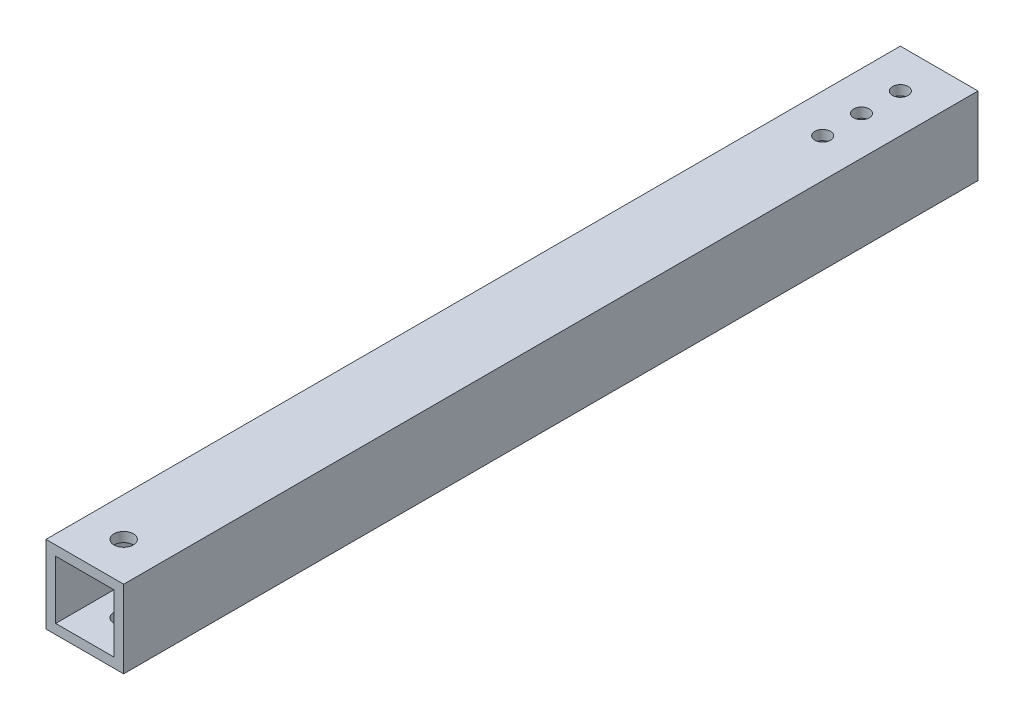
ISO-10303-21;
HEADER;
FILE_DESCRIPTION(('STEP AP214'),'2;1');
FILE_NAME('part.step','',(''),(''),'','','');
FILE_SCHEMA(('AUTOMOTIVE_DESIGN { 1 0 10303 214 1 1 1 1 }'));
ENDSEC;
DATA;
#1=APPLICATION_CONTEXT('core data for automotive mechanical design processes');
#2=APPLICATION_PROTOCOL_DEFINITION('international standard','automotive_design',2000,#1);
#3=PRODUCT_CONTEXT('',#1,'mechanical');
#4=PRODUCT('Part','Part','',(#3));
#5=PRODUCT_RELATED_PRODUCT_CATEGORY('part','',(#4));
#6=PRODUCT_DEFINITION_FORMATION('','',#4);
#7=PRODUCT_DEFINITION_CONTEXT('part definition',#1,'design');
#8=PRODUCT_DEFINITION('design','',#6,#7);
#9=PRODUCT_DEFINITION_SHAPE('','',#8);
#10=(LENGTH_UNIT() NAMED_UNIT(*) SI_UNIT(.MILLI.,.METRE.));
#11=(NAMED_UNIT(*) PLANE_ANGLE_UNIT() SI_UNIT($,.RADIAN.));
#12=(NAMED_UNIT(*) SI_UNIT($,.STERADIAN.) SOLID_ANGLE_UNIT());
#13=UNCERTAINTY_MEASURE_WITH_UNIT(LENGTH_MEASURE(1.E-05),#10,'distance_accuracy_value','');
#14=(GEOMETRIC_REPRESENTATION_CONTEXT(3) GLOBAL_UNCERTAINTY_ASSIGNED_CONTEXT((#13)) GLOBAL_UNIT_ASSIGNED_CONTEXT((#10,
#11,#12)) REPRESENTATION_CONTEXT('',''));
#15=CARTESIAN_POINT('',(0.,0.,0.));
#16=DIRECTION('',(0.,0.,1.));
#17=DIRECTION('',(1.,0.,0.));
#18=AXIS2_PLACEMENT_3D('',#15,#16,#17);
#19=CARTESIAN_POINT('',(0.,0.,279.4));
#20=DIRECTION('',(0.,1.,0.));
#21=DIRECTION('',(0.,0.,1.));
#22=AXIS2_PLACEMENT_3D('',#19,#20,#21);
#23=PLANE('',#22);
#24=CARTESIAN_POINT('',(-12.7,0.,266.7));
#25=DIRECTION('',(0.,1.,0.));
#26=DIRECTION('',(0.,0.,1.));
#27=AXIS2_PLACEMENT_3D('',#24,#25,#26);
#28=CIRCLE('',#27,3.175);
#29=CARTESIAN_POINT('',(-12.7,0.,263.525));
#30=VERTEX_POINT('',#29);
#31=EDGE_CURVE('E134',#30,#30,#28,.T.);
#32=ORIENTED_EDGE('',*,*,#31,.T.);
#33=EDGE_LOOP('',(#32));
#34=FACE_BOUND('',#33,.T.);
#35=DIRECTION('',(1.,0.,0.));
#36=VECTOR('',#35,1.);
#37=CARTESIAN_POINT('',(0.,0.,0.));
#38=LINE('',#37,#36);
#39=CARTESIAN_POINT('',(-25.4,0.,0.));
#40=VERTEX_POINT('',#39);
#41=CARTESIAN_POINT('',(0.,0.,0.));
#42=VERTEX_POINT('',#41);
#43=EDGE_CURVE('E148',#40,#42,#38,.T.);
#44=ORIENTED_EDGE('',*,*,#43,.T.);
#45=DIRECTION('',(0.,0.,-1.));
#46=VECTOR('',#45,1.);
#47=CARTESIAN_POINT('',(0.,0.,279.4));
#48=LINE('',#47,#46);
#49=CARTESIAN_POINT('',(0.,0.,279.4));
#50=VERTEX_POINT('',#49);
#51=EDGE_CURVE('E154',#50,#42,#48,.T.);
#52=ORIENTED_EDGE('',*,*,#51,.F.);
#53=DIRECTION('',(1.,0.,0.));
#54=VECTOR('',#53,1.);
#55=CARTESIAN_POINT('',(0.,0.,279.4));
#56=LINE('',#55,#54);
#57=CARTESIAN_POINT('',(-25.4,0.,279.4));
#58=VERTEX_POINT('',#57);
#59=EDGE_CURVE('E152',#58,#50,#56,.T.);
#60=ORIENTED_EDGE('',*,*,#59,.F.);
#61=DIRECTION('',(0.,0.,-1.));
#62=VECTOR('',#61,1.);
#63=CARTESIAN_POINT('',(-25.4,0.,279.4));
#64=LINE('',#63,#62);
#65=EDGE_CURVE('E164',#58,#40,#64,.T.);
#66=ORIENTED_EDGE('',*,*,#65,.T.);
#67=EDGE_LOOP('',(#44,#52,#60,#66));
#68=FACE_BOUND('',#67,.T.);
#69=CARTESIAN_POINT('',(-12.7,0.,12.7));
#70=DIRECTION('',(0.,1.,0.));
#71=DIRECTION('',(0.,0.,1.));
#72=AXIS2_PLACEMENT_3D('',#69,#70,#71);
#73=CIRCLE('',#72,2.55269999999999);
#74=CARTESIAN_POINT('',(-12.7,0.,15.2527));
#75=VERTEX_POINT('',#74);
#76=EDGE_CURVE('E177',#75,#75,#73,.F.);
#77=ORIENTED_EDGE('',*,*,#76,.F.);
#78=EDGE_LOOP('',(#77));
#79=FACE_BOUND('',#78,.T.);
#80=CARTESIAN_POINT('',(-12.7,0.,25.4));
#81=DIRECTION('',(0.,1.,0.));
#82=DIRECTION('',(0.,0.,1.));
#83=AXIS2_PLACEMENT_3D('',#80,#81,#82);
#84=CIRCLE('',#83,2.55269999999999);
#85=CARTESIAN_POINT('',(-12.7,0.,27.9527));
#86=VERTEX_POINT('',#85);
#87=EDGE_CURVE('E181',#86,#86,#84,.F.);
#88=ORIENTED_EDGE('',*,*,#87,.F.);
#89=EDGE_LOOP('',(#88));
#90=FACE_BOUND('',#89,.T.);
#91=CARTESIAN_POINT('',(-12.7,0.,38.1));
#92=DIRECTION('',(0.,1.,0.));
#93=DIRECTION('',(0.,0.,1.));
#94=AXIS2_PLACEMENT_3D('',#91,#92,#93);
#95=CIRCLE('',#94,2.55269999999999);
#96=CARTESIAN_POINT('',(-12.7,0.,40.6527));
#97=VERTEX_POINT('',#96);
#98=EDGE_CURVE('E276',#97,#97,#95,.F.);
#99=ORIENTED_EDGE('',*,*,#98,.F.);
#100=EDGE_LOOP('',(#99));
#101=FACE_BOUND('',#100,.T.);
#102=ADVANCED_FACE('F38',(#34,#68,#79,#90,#101),#23,.F.);
#103=CARTESIAN_POINT('',(0.,0.,279.4));
#104=DIRECTION('',(0.,0.,1.));
#105=DIRECTION('',(1.,0.,0.));
#106=AXIS2_PLACEMENT_3D('',#103,#104,#105);
#107=PLANE('',#106);
#108=DIRECTION('',(0.,1.,0.));
#109=VECTOR('',#108,1.);
#110=CARTESIAN_POINT('',(0.,0.,279.4));
#111=LINE('',#110,#109);
#112=CARTESIAN_POINT('',(0.,25.4,279.4));
#113=VERTEX_POINT('',#112);
#114=EDGE_CURVE('E144',#50,#113,#111,.T.);
#115=ORIENTED_EDGE('',*,*,#114,.T.);
#116=DIRECTION('',(-1.,0.,0.));
#117=VECTOR('',#116,1.);
#118=CARTESIAN_POINT('',(0.,25.4,279.4));
#119=LINE('',#118,#117);
#120=CARTESIAN_POINT('',(-25.4,25.4,279.4));
#121=VERTEX_POINT('',#120);
#122=EDGE_CURVE('E147',#113,#121,#119,.T.);
#123=ORIENTED_EDGE('',*,*,#122,.T.);
#124=DIRECTION('',(0.,-1.,0.));
#125=VECTOR('',#124,1.);
#126=CARTESIAN_POINT('',(-25.4,0.,279.4));
#127=LINE('',#126,#125);
#128=EDGE_CURVE('E150',#121,#58,#127,.T.);
#129=ORIENTED_EDGE('',*,*,#128,.T.);
#130=ORIENTED_EDGE('',*,*,#59,.T.);
#131=EDGE_LOOP('',(#115,#123,#129,#130));
#132=FACE_BOUND('',#131,.T.);
#133=DIRECTION('',(-1.,0.,0.));
#134=VECTOR('',#133,1.);
#135=CARTESIAN_POINT('',(-3.175,22.225,279.4));
#136=LINE('',#135,#134);
#137=CARTESIAN_POINT('',(-3.175,22.225,279.4));
#138=VERTEX_POINT('',#137);
#139=CARTESIAN_POINT('',(-22.225,22.225,279.4));
#140=VERTEX_POINT('',#139);
#141=EDGE_CURVE('E113',#138,#140,#136,.T.);
#142=ORIENTED_EDGE('',*,*,#141,.F.);
#143=DIRECTION('',(0.,1.,0.));
#144=VECTOR('',#143,1.);
#145=CARTESIAN_POINT('',(-3.175,3.175,279.4));
#146=LINE('',#145,#144);
#147=CARTESIAN_POINT('',(-3.175,3.175,279.4));
#148=VERTEX_POINT('',#147);
#149=EDGE_CURVE('E105',#148,#138,#146,.T.);
#150=ORIENTED_EDGE('',*,*,#149,.F.);
#151=DIRECTION('',(1.,0.,0.));
#152=VECTOR('',#151,1.);
#153=CARTESIAN_POINT('',(-3.175,3.175,279.4));
#154=LINE('',#153,#152);
#155=CARTESIAN_POINT('',(-22.225,3.175,279.4));
#156=VERTEX_POINT('',#155);
#157=EDGE_CURVE('E128',#156,#148,#154,.T.);
#158=ORIENTED_EDGE('',*,*,#157,.F.);
#159=DIRECTION('',(0.,-1.,0.));
#160=VECTOR('',#159,1.);
#161=CARTESIAN_POINT('',(-22.225,3.175,279.4));
#162=LINE('',#161,#160);
#163=EDGE_CURVE('E126',#140,#156,#162,.T.);
#164=ORIENTED_EDGE('',*,*,#163,.F.);
#165=EDGE_LOOP('',(#142,#150,#158,#164));
#166=FACE_BOUND('',#165,.T.);
#167=ADVANCED_FACE('F125',(#132,#166),#107,.T.);
#168=CARTESIAN_POINT('',(0.,0.,0.));
#169=DIRECTION('',(0.,0.,1.));
#170=DIRECTION('',(1.,0.,0.));
#171=AXIS2_PLACEMENT_3D('',#168,#169,#170);
#172=PLANE('',#171);
#173=DIRECTION('',(0.,1.,0.));
#174=VECTOR('',#173,1.);
#175=CARTESIAN_POINT('',(0.,0.,0.));
#176=LINE('',#175,#174);
#177=CARTESIAN_POINT('',(0.,25.4,0.));
#178=VERTEX_POINT('',#177);
#179=EDGE_CURVE('E121',#42,#178,#176,.T.);
#180=ORIENTED_EDGE('',*,*,#179,.F.);
#181=ORIENTED_EDGE('',*,*,#43,.F.);
#182=DIRECTION('',(0.,-1.,0.));
#183=VECTOR('',#182,1.);
#184=CARTESIAN_POINT('',(-25.4,0.,0.));
#185=LINE('',#184,#183);
#186=CARTESIAN_POINT('',(-25.4,25.4,0.));
#187=VERTEX_POINT('',#186);
#188=EDGE_CURVE('E159',#187,#40,#185,.T.);
#189=ORIENTED_EDGE('',*,*,#188,.F.);
#190=DIRECTION('',(-1.,0.,0.));
#191=VECTOR('',#190,1.);
#192=CARTESIAN_POINT('',(0.,25.4,0.));
#193=LINE('',#192,#191);
#194=EDGE_CURVE('E157',#178,#187,#193,.T.);
#195=ORIENTED_EDGE('',*,*,#194,.F.);
#196=EDGE_LOOP('',(#180,#181,#189,#195));
#197=FACE_BOUND('',#196,.T.);
#198=DIRECTION('',(0.,1.,0.));
#199=VECTOR('',#198,1.);
#200=CARTESIAN_POINT('',(-3.175,3.175,0.));
#201=LINE('',#200,#199);
#202=CARTESIAN_POINT('',(-3.175,3.175,0.));
#203=VERTEX_POINT('',#202);
#204=CARTESIAN_POINT('',(-3.175,22.225,0.));
#205=VERTEX_POINT('',#204);
#206=EDGE_CURVE('E63',#203,#205,#201,.T.);
#207=ORIENTED_EDGE('',*,*,#206,.T.);
#208=DIRECTION('',(-1.,0.,0.));
#209=VECTOR('',#208,1.);
#210=CARTESIAN_POINT('',(-3.175,22.225,0.));
#211=LINE('',#210,#209);
#212=CARTESIAN_POINT('',(-22.225,22.225,0.));
#213=VERTEX_POINT('',#212);
#214=EDGE_CURVE('E120',#205,#213,#211,.T.);
#215=ORIENTED_EDGE('',*,*,#214,.T.);
#216=DIRECTION('',(0.,-1.,0.));
#217=VECTOR('',#216,1.);
#218=CARTESIAN_POINT('',(-22.225,3.175,0.));
#219=LINE('',#218,#217);
#220=CARTESIAN_POINT('',(-22.225,3.175,0.));
#221=VERTEX_POINT('',#220);
#222=EDGE_CURVE('E136',#213,#221,#219,.T.);
#223=ORIENTED_EDGE('',*,*,#222,.T.);
#224=DIRECTION('',(1.,0.,0.));
#225=VECTOR('',#224,1.);
#226=CARTESIAN_POINT('',(-3.175,3.175,0.));
#227=LINE('',#226,#225);
#228=EDGE_CURVE('E114',#221,#203,#227,.T.);
#229=ORIENTED_EDGE('',*,*,#228,.T.);
#230=EDGE_LOOP('',(#207,#215,#223,#229));
#231=FACE_BOUND('',#230,.T.);
#232=ADVANCED_FACE('F233',(#197,#231),#172,.F.);
#233=CARTESIAN_POINT('',(0.,0.,279.4));
#234=DIRECTION('',(-1.,0.,0.));
#235=DIRECTION('',(0.,-1.,0.));
#236=AXIS2_PLACEMENT_3D('',#233,#234,#235);
#237=PLANE('',#236);
#238=ORIENTED_EDGE('',*,*,#179,.T.);
#239=DIRECTION('',(0.,0.,-1.));
#240=VECTOR('',#239,1.);
#241=CARTESIAN_POINT('',(0.,25.4,279.4));
#242=LINE('',#241,#240);
#243=EDGE_CURVE('E11',#113,#178,#242,.T.);
#244=ORIENTED_EDGE('',*,*,#243,.F.);
#245=ORIENTED_EDGE('',*,*,#114,.F.);
#246=ORIENTED_EDGE('',*,*,#51,.T.);
#247=EDGE_LOOP('',(#238,#244,#245,#246));
#248=FACE_BOUND('',#247,.T.);
#249=ADVANCED_FACE('F40',(#248),#237,.F.);
#250=CARTESIAN_POINT('',(0.,25.4,279.4));
#251=DIRECTION('',(0.,-1.,0.));
#252=DIRECTION('',(1.,0.,0.));
#253=AXIS2_PLACEMENT_3D('',#250,#251,#252);
#254=PLANE('',#253);
#255=CARTESIAN_POINT('',(-12.7,25.4,38.1));
#256=DIRECTION('',(0.,1.,0.));
#257=DIRECTION('',(0.,0.,1.));
#258=AXIS2_PLACEMENT_3D('',#255,#256,#257);
#259=CIRCLE('',#258,2.55269999999999);
#260=CARTESIAN_POINT('',(-12.7,25.4,40.6527));
#261=VERTEX_POINT('',#260);
#262=EDGE_CURVE('E251',#261,#261,#259,.T.);
#263=ORIENTED_EDGE('',*,*,#262,.F.);
#264=EDGE_LOOP('',(#263));
#265=FACE_BOUND('',#264,.T.);
#266=CARTESIAN_POINT('',(-12.7,25.4,25.4));
#267=DIRECTION('',(0.,1.,0.));
#268=DIRECTION('',(0.,0.,1.));
#269=AXIS2_PLACEMENT_3D('',#266,#267,#268);
#270=CIRCLE('',#269,2.55269999999999);
#271=CARTESIAN_POINT('',(-12.7,25.4,27.9527));
#272=VERTEX_POINT('',#271);
#273=EDGE_CURVE('E188',#272,#272,#270,.T.);
#274=ORIENTED_EDGE('',*,*,#273,.F.);
#275=EDGE_LOOP('',(#274));
#276=FACE_BOUND('',#275,.T.);
#277=CARTESIAN_POINT('',(-12.7,25.4,12.7));
#278=DIRECTION('',(0.,1.,0.));
#279=DIRECTION('',(0.,0.,1.));
#280=AXIS2_PLACEMENT_3D('',#277,#278,#279);
#281=CIRCLE('',#280,2.55269999999999);
#282=CARTESIAN_POINT('',(-12.7,25.4,15.2527));
#283=VERTEX_POINT('',#282);
#284=EDGE_CURVE('E185',#283,#283,#281,.T.);
#285=ORIENTED_EDGE('',*,*,#284,.F.);
#286=EDGE_LOOP('',(#285));
#287=FACE_BOUND('',#286,.T.);
#288=CARTESIAN_POINT('',(-12.7,25.4,266.7));
#289=DIRECTION('',(0.,-1.,0.));
#290=DIRECTION('',(0.,0.,-1.));
#291=AXIS2_PLACEMENT_3D('',#288,#289,#290);
#292=CIRCLE('',#291,3.175);
#293=CARTESIAN_POINT('',(-12.7,25.4,263.525));
#294=VERTEX_POINT('',#293);
#295=EDGE_CURVE('E173',#294,#294,#292,.T.);
#296=ORIENTED_EDGE('',*,*,#295,.T.);
#297=EDGE_LOOP('',(#296));
#298=FACE_BOUND('',#297,.T.);
#299=ORIENTED_EDGE('',*,*,#194,.T.);
#300=DIRECTION('',(0.,0.,-1.));
#301=VECTOR('',#300,1.);
#302=CARTESIAN_POINT('',(-25.4,25.4,279.4));
#303=LINE('',#302,#301);
#304=EDGE_CURVE('E47',#121,#187,#303,.T.);
#305=ORIENTED_EDGE('',*,*,#304,.F.);
#306=ORIENTED_EDGE('',*,*,#122,.F.);
#307=ORIENTED_EDGE('',*,*,#243,.T.);
#308=EDGE_LOOP('',(#299,#305,#306,#307));
#309=FACE_BOUND('',#308,.T.);
#310=ADVANCED_FACE('F240',(#265,#276,#287,#298,#309),#254,.F.);
#311=CARTESIAN_POINT('',(-25.4,0.,279.4));
#312=DIRECTION('',(1.,0.,0.));
#313=DIRECTION('',(0.,0.,-1.));
#314=AXIS2_PLACEMENT_3D('',#311,#312,#313);
#315=PLANE('',#314);
#316=ORIENTED_EDGE('',*,*,#188,.T.);
#317=ORIENTED_EDGE('',*,*,#65,.F.);
#318=ORIENTED_EDGE('',*,*,#128,.F.);
#319=ORIENTED_EDGE('',*,*,#304,.T.);
#320=EDGE_LOOP('',(#316,#317,#318,#319));
#321=FACE_BOUND('',#320,.T.);
#322=ADVANCED_FACE('F238',(#321),#315,.F.);
#323=CARTESIAN_POINT('',(-3.175,3.175,279.4));
#324=DIRECTION('',(-1.,0.,0.));
#325=DIRECTION('',(0.,0.,1.));
#326=AXIS2_PLACEMENT_3D('',#323,#324,#325);
#327=PLANE('',#326);
#328=ORIENTED_EDGE('',*,*,#206,.F.);
#329=DIRECTION('',(0.,0.,-1.));
#330=VECTOR('',#329,1.);
#331=CARTESIAN_POINT('',(-3.175,3.175,279.4));
#332=LINE('',#331,#330);
#333=EDGE_CURVE('E109',#148,#203,#332,.T.);
#334=ORIENTED_EDGE('',*,*,#333,.F.);
#335=ORIENTED_EDGE('',*,*,#149,.T.);
#336=DIRECTION('',(0.,0.,-1.));
#337=VECTOR('',#336,1.);
#338=CARTESIAN_POINT('',(-3.175,22.225,279.4));
#339=LINE('',#338,#337);
#340=EDGE_CURVE('E108',#138,#205,#339,.T.);
#341=ORIENTED_EDGE('',*,*,#340,.T.);
#342=EDGE_LOOP('',(#328,#334,#335,#341));
#343=FACE_BOUND('',#342,.T.);
#344=ADVANCED_FACE('F107',(#343),#327,.T.);
#345=CARTESIAN_POINT('',(-3.175,22.225,279.4));
#346=DIRECTION('',(0.,-1.,0.));
#347=DIRECTION('',(1.,0.,0.));
#348=AXIS2_PLACEMENT_3D('',#345,#346,#347);
#349=PLANE('',#348);
#350=CARTESIAN_POINT('',(-12.7,22.225,38.1));
#351=DIRECTION('',(0.,-1.,0.));
#352=DIRECTION('',(1.,0.,0.));
#353=AXIS2_PLACEMENT_3D('',#350,#351,#352);
#354=CIRCLE('',#353,2.55269999999999);
#355=CARTESIAN_POINT('',(-10.1473,22.225,38.1));
#356=VERTEX_POINT('',#355);
#357=EDGE_CURVE('E193',#356,#356,#354,.T.);
#358=ORIENTED_EDGE('',*,*,#357,.F.);
#359=EDGE_LOOP('',(#358));
#360=FACE_BOUND('',#359,.T.);
#361=CARTESIAN_POINT('',(-12.7,22.225,25.4));
#362=DIRECTION('',(0.,-1.,0.));
#363=DIRECTION('',(1.,0.,0.));
#364=AXIS2_PLACEMENT_3D('',#361,#362,#363);
#365=CIRCLE('',#364,2.55269999999999);
#366=CARTESIAN_POINT('',(-10.1473,22.225,25.4));
#367=VERTEX_POINT('',#366);
#368=EDGE_CURVE('E180',#367,#367,#365,.T.);
#369=ORIENTED_EDGE('',*,*,#368,.F.);
#370=EDGE_LOOP('',(#369));
#371=FACE_BOUND('',#370,.T.);
#372=CARTESIAN_POINT('',(-12.7,22.225,12.7));
#373=DIRECTION('',(0.,-1.,0.));
#374=DIRECTION('',(1.,0.,0.));
#375=AXIS2_PLACEMENT_3D('',#372,#373,#374);
#376=CIRCLE('',#375,2.55269999999999);
#377=CARTESIAN_POINT('',(-10.1473,22.225,12.7));
#378=VERTEX_POINT('',#377);
#379=EDGE_CURVE('E176',#378,#378,#376,.T.);
#380=ORIENTED_EDGE('',*,*,#379,.F.);
#381=EDGE_LOOP('',(#380));
#382=FACE_BOUND('',#381,.T.);
#383=CARTESIAN_POINT('',(-12.7,22.225,266.7));
#384=DIRECTION('',(0.,-1.,0.));
#385=DIRECTION('',(1.,0.,0.));
#386=AXIS2_PLACEMENT_3D('',#383,#384,#385);
#387=CIRCLE('',#386,3.175);
#388=CARTESIAN_POINT('',(-12.7,22.225,263.525));
#389=VERTEX_POINT('',#388);
#390=EDGE_CURVE('E172',#389,#389,#387,.T.);
#391=ORIENTED_EDGE('',*,*,#390,.F.);
#392=EDGE_LOOP('',(#391));
#393=FACE_BOUND('',#392,.T.);
#394=ORIENTED_EDGE('',*,*,#214,.F.);
#395=ORIENTED_EDGE('',*,*,#340,.F.);
#396=ORIENTED_EDGE('',*,*,#141,.T.);
#397=DIRECTION('',(0.,0.,-1.));
#398=VECTOR('',#397,1.);
#399=CARTESIAN_POINT('',(-22.225,22.225,279.4));
#400=LINE('',#399,#398);
#401=EDGE_CURVE('E122',#140,#213,#400,.T.);
#402=ORIENTED_EDGE('',*,*,#401,.T.);
#403=EDGE_LOOP('',(#394,#395,#396,#402));
#404=FACE_BOUND('',#403,.T.);
#405=ADVANCED_FACE('F117',(#360,#371,#382,#393,#404),#349,.T.);
#406=CARTESIAN_POINT('',(-22.225,3.175,279.4));
#407=DIRECTION('',(1.,0.,0.));
#408=DIRECTION('',(0.,1.,0.));
#409=AXIS2_PLACEMENT_3D('',#406,#407,#408);
#410=PLANE('',#409);
#411=ORIENTED_EDGE('',*,*,#222,.F.);
#412=ORIENTED_EDGE('',*,*,#401,.F.);
#413=ORIENTED_EDGE('',*,*,#163,.T.);
#414=DIRECTION('',(0.,0.,-1.));
#415=VECTOR('',#414,1.);
#416=CARTESIAN_POINT('',(-22.225,3.175,279.4));
#417=LINE('',#416,#415);
#418=EDGE_CURVE('E55',#156,#221,#417,.T.);
#419=ORIENTED_EDGE('',*,*,#418,.T.);
#420=EDGE_LOOP('',(#411,#412,#413,#419));
#421=FACE_BOUND('',#420,.T.);
#422=ADVANCED_FACE('F224',(#421),#410,.T.);
#423=CARTESIAN_POINT('',(-3.175,3.175,279.4));
#424=DIRECTION('',(0.,1.,0.));
#425=DIRECTION('',(-1.,0.,0.));
#426=AXIS2_PLACEMENT_3D('',#423,#424,#425);
#427=PLANE('',#426);
#428=CARTESIAN_POINT('',(-12.7,3.175,38.1));
#429=DIRECTION('',(0.,1.,0.));
#430=DIRECTION('',(-1.,0.,0.));
#431=AXIS2_PLACEMENT_3D('',#428,#429,#430);
#432=CIRCLE('',#431,2.55269999999999);
#433=CARTESIAN_POINT('',(-15.2527,3.175,38.1));
#434=VERTEX_POINT('',#433);
#435=EDGE_CURVE('E42',#434,#434,#432,.T.);
#436=ORIENTED_EDGE('',*,*,#435,.F.);
#437=EDGE_LOOP('',(#436));
#438=FACE_BOUND('',#437,.T.);
#439=CARTESIAN_POINT('',(-12.7,3.175,25.4));
#440=DIRECTION('',(0.,1.,0.));
#441=DIRECTION('',(-1.,0.,0.));
#442=AXIS2_PLACEMENT_3D('',#439,#440,#441);
#443=CIRCLE('',#442,2.55269999999999);
#444=CARTESIAN_POINT('',(-15.2527,3.175,25.4));
#445=VERTEX_POINT('',#444);
#446=EDGE_CURVE('E178',#445,#445,#443,.T.);
#447=ORIENTED_EDGE('',*,*,#446,.F.);
#448=EDGE_LOOP('',(#447));
#449=FACE_BOUND('',#448,.T.);
#450=CARTESIAN_POINT('',(-12.7,3.175,12.7));
#451=DIRECTION('',(0.,1.,0.));
#452=DIRECTION('',(-1.,0.,0.));
#453=AXIS2_PLACEMENT_3D('',#450,#451,#452);
#454=CIRCLE('',#453,2.55269999999999);
#455=CARTESIAN_POINT('',(-15.2527,3.175,12.7));
#456=VERTEX_POINT('',#455);
#457=EDGE_CURVE('E174',#456,#456,#454,.T.);
#458=ORIENTED_EDGE('',*,*,#457,.F.);
#459=EDGE_LOOP('',(#458));
#460=FACE_BOUND('',#459,.T.);
#461=CARTESIAN_POINT('',(-12.7,3.175,266.7));
#462=DIRECTION('',(0.,1.,0.));
#463=DIRECTION('',(-1.,0.,0.));
#464=AXIS2_PLACEMENT_3D('',#461,#462,#463);
#465=CIRCLE('',#464,3.175);
#466=CARTESIAN_POINT('',(-12.7,3.175,263.525));
#467=VERTEX_POINT('',#466);
#468=EDGE_CURVE('E169',#467,#467,#465,.T.);
#469=ORIENTED_EDGE('',*,*,#468,.F.);
#470=EDGE_LOOP('',(#469));
#471=FACE_BOUND('',#470,.T.);
#472=ORIENTED_EDGE('',*,*,#228,.F.);
#473=ORIENTED_EDGE('',*,*,#418,.F.);
#474=ORIENTED_EDGE('',*,*,#157,.T.);
#475=ORIENTED_EDGE('',*,*,#333,.T.);
#476=EDGE_LOOP('',(#472,#473,#474,#475));
#477=FACE_BOUND('',#476,.T.);
#478=ADVANCED_FACE('F215',(#438,#449,#460,#471,#477),#427,.T.);
#479=CARTESIAN_POINT('',(-12.7,25.4,266.7));
#480=DIRECTION('',(0.,-1.,0.));
#481=DIRECTION('',(0.,0.,-1.));
#482=AXIS2_PLACEMENT_3D('',#479,#480,#481);
#483=CYLINDRICAL_SURFACE('',#482,3.175);
#484=CARTESIAN_POINT('',(-12.7,3.175,263.525));
#485=CARTESIAN_POINT('',(-12.7,3.14192708333333,263.525));
#486=CARTESIAN_POINT('',(-12.7,3.10885416666666,263.525));
#487=CARTESIAN_POINT('',(-12.7,3.04270833333333,263.525));
#488=CARTESIAN_POINT('',(-12.7,3.00963541666666,263.525));
#489=CARTESIAN_POINT('',(-12.7,2.94348958333333,263.525));
#490=CARTESIAN_POINT('',(-12.7,2.91041666666666,263.525));
#491=CARTESIAN_POINT('',(-12.7,2.84427083333333,263.525));
#492=CARTESIAN_POINT('',(-12.7,2.81119791666667,263.525));
#493=CARTESIAN_POINT('',(-12.7,2.74505208333333,263.525));
#494=CARTESIAN_POINT('',(-12.7,2.71197916666667,263.525));
#495=CARTESIAN_POINT('',(-12.7,2.64583333333333,263.525));
#496=CARTESIAN_POINT('',(-12.7,2.61276041666666,263.525));
#497=CARTESIAN_POINT('',(-12.7,2.54661458333333,263.525));
#498=CARTESIAN_POINT('',(-12.7,2.51354166666667,263.525));
#499=CARTESIAN_POINT('',(-12.7,2.44739583333333,263.525));
#500=CARTESIAN_POINT('',(-12.7,2.41432291666667,263.525));
#501=CARTESIAN_POINT('',(-12.7,2.34817708333333,263.525));
#502=CARTESIAN_POINT('',(-12.7,2.31510416666666,263.525));
#503=CARTESIAN_POINT('',(-12.7,2.24895833333333,263.525));
#504=CARTESIAN_POINT('',(-12.7,2.21588541666666,263.525));
#505=CARTESIAN_POINT('',(-12.7,2.14973958333333,263.525));
#506=CARTESIAN_POINT('',(-12.7,2.11666666666666,263.525));
#507=CARTESIAN_POINT('',(-12.7,2.05052083333333,263.525));
#508=CARTESIAN_POINT('',(-12.7,2.01744791666666,263.525));
#509=CARTESIAN_POINT('',(-12.7,1.95130208333333,263.525));
#510=CARTESIAN_POINT('',(-12.7,1.91822916666666,263.525));
#511=CARTESIAN_POINT('',(-12.7,1.85208333333333,263.525));
#512=CARTESIAN_POINT('',(-12.7,1.81901041666666,263.525));
#513=CARTESIAN_POINT('',(-12.7,1.75286458333333,263.525));
#514=CARTESIAN_POINT('',(-12.7,1.71979166666667,263.525));
#515=CARTESIAN_POINT('',(-12.7,1.65364583333333,263.525));
#516=CARTESIAN_POINT('',(-12.7,1.62057291666667,263.525));
#517=CARTESIAN_POINT('',(-12.7,1.55442708333333,263.525));
#518=CARTESIAN_POINT('',(-12.7,1.52135416666666,263.525));
#519=CARTESIAN_POINT('',(-12.7,1.45520833333333,263.525));
#520=CARTESIAN_POINT('',(-12.7,1.42213541666667,263.525));
#521=CARTESIAN_POINT('',(-12.7,1.35598958333333,263.525));
#522=CARTESIAN_POINT('',(-12.7,1.32291666666667,263.525));
#523=CARTESIAN_POINT('',(-12.7,1.25677083333333,263.525));
#524=CARTESIAN_POINT('',(-12.7,1.22369791666667,263.525));
#525=CARTESIAN_POINT('',(-12.7,1.15755208333333,263.525));
#526=CARTESIAN_POINT('',(-12.7,1.12447916666667,263.525));
#527=CARTESIAN_POINT('',(-12.7,1.05833333333333,263.525));
#528=CARTESIAN_POINT('',(-12.7,1.02526041666667,263.525));
#529=CARTESIAN_POINT('',(-12.7,0.959114583333332,263.525));
#530=CARTESIAN_POINT('',(-12.7,0.926041666666666,263.525));
#531=CARTESIAN_POINT('',(-12.7,0.859895833333334,263.525));
#532=CARTESIAN_POINT('',(-12.7,0.826822916666666,263.525));
#533=CARTESIAN_POINT('',(-12.7,0.760677083333332,263.525));
#534=CARTESIAN_POINT('',(-12.7,0.727604166666665,263.525));
#535=CARTESIAN_POINT('',(-12.7,0.661458333333332,263.525));
#536=CARTESIAN_POINT('',(-12.7,0.628385416666666,263.525));
#537=CARTESIAN_POINT('',(-12.7,0.562239583333333,263.525));
#538=CARTESIAN_POINT('',(-12.7,0.529166666666666,263.525));
#539=CARTESIAN_POINT('',(-12.7,0.463020833333332,263.525));
#540=CARTESIAN_POINT('',(-12.7,0.429947916666665,263.525));
#541=CARTESIAN_POINT('',(-12.7,0.363802083333332,263.525));
#542=CARTESIAN_POINT('',(-12.7,0.330729166666666,263.525));
#543=CARTESIAN_POINT('',(-12.7,0.264583333333333,263.525));
#544=CARTESIAN_POINT('',(-12.7,0.231510416666666,263.525));
#545=CARTESIAN_POINT('',(-12.7,0.165364583333333,263.525));
#546=CARTESIAN_POINT('',(-12.7,0.132291666666667,263.525));
#547=CARTESIAN_POINT('',(-12.7,0.0661458333333342,263.525));
#548=CARTESIAN_POINT('',(-12.7,0.0330729166666671,263.525));
#549=CARTESIAN_POINT('',(-12.7,0.,263.525));
#550=B_SPLINE_CURVE_WITH_KNOTS('',3,(#484,#485,#486,#487,#488,#489,#490,#491,#492,#493,#494,
#495,#496,#497,#498,#499,#500,#501,#502,#503,#504,#505,#506,#507,#508,#509,#510,#511,#512,#513,
#514,#515,#516,#517,#518,#519,#520,#521,#522,#523,#524,#525,#526,#527,#528,#529,#530,#531,#532,
#533,#534,#535,#536,#537,#538,#539,#540,#541,#542,#543,#544,#545,#546,#547,#548,#549),
.UNSPECIFIED.,.F.,.F.,(4,2,2,2,2,2,2,2,2,2,2,2,2,2,2,2,2,2,2,2,2,2,2,2,2,2,2,2,2,2,2,2,4),(0.,
0.0992187500000012,0.198437499999999,0.29765625,0.396874999999998,0.496093749999999,0.5953125,
0.694531249999998,0.793749999999999,0.892968750000001,0.992187499999998,1.09140625,1.190625,
1.28984375,1.3890625,1.48828125,1.5875,1.68671875,1.7859375,1.88515625,1.984375,2.08359375,
2.1828125,2.28203125,2.38125,2.48046875,2.5796875,2.67890625,2.778125,2.87734375,2.9765625,
3.07578125,3.175),.UNSPECIFIED.);
#551=EDGE_CURVE('BSEAM212',#467,#30,#550,.T.);
#552=ORIENTED_EDGE('',*,*,#468,.T.);
#553=ORIENTED_EDGE('',*,*,#31,.F.);
#554=ORIENTED_EDGE('',*,*,#551,.T.);
#555=ORIENTED_EDGE('',*,*,#551,.F.);
#556=EDGE_LOOP('',(#552,#554,#553,#555));
#557=FACE_BOUND('',#556,.T.);
#558=ADVANCED_FACE('F212',(#557),#483,.F.);
#559=CARTESIAN_POINT('',(-12.7,22.225,263.525));
#560=CARTESIAN_POINT('',(-12.7,22.2580729166667,263.525));
#561=CARTESIAN_POINT('',(-12.7,22.2911458333333,263.525));
#562=CARTESIAN_POINT('',(-12.7,22.3572916666667,263.525));
#563=CARTESIAN_POINT('',(-12.7,22.3903645833333,263.525));
#564=CARTESIAN_POINT('',(-12.7,22.4565104166667,263.525));
#565=CARTESIAN_POINT('',(-12.7,22.4895833333333,263.525));
#566=CARTESIAN_POINT('',(-12.7,22.5557291666667,263.525));
#567=CARTESIAN_POINT('',(-12.7,22.5888020833333,263.525));
#568=CARTESIAN_POINT('',(-12.7,22.6549479166667,263.525));
#569=CARTESIAN_POINT('',(-12.7,22.6880208333333,263.525));
#570=CARTESIAN_POINT('',(-12.7,22.7541666666667,263.525));
#571=CARTESIAN_POINT('',(-12.7,22.7872395833333,263.525));
#572=CARTESIAN_POINT('',(-12.7,22.8533854166667,263.525));
#573=CARTESIAN_POINT('',(-12.7,22.8864583333333,263.525));
#574=CARTESIAN_POINT('',(-12.7,22.9526041666667,263.525));
#575=CARTESIAN_POINT('',(-12.7,22.9856770833333,263.525));
#576=CARTESIAN_POINT('',(-12.7,23.0518229166667,263.525));
#577=CARTESIAN_POINT('',(-12.7,23.0848958333333,263.525));
#578=CARTESIAN_POINT('',(-12.7,23.1510416666667,263.525));
#579=CARTESIAN_POINT('',(-12.7,23.1841145833333,263.525));
#580=CARTESIAN_POINT('',(-12.7,23.2502604166667,263.525));
#581=CARTESIAN_POINT('',(-12.7,23.2833333333333,263.525));
#582=CARTESIAN_POINT('',(-12.7,23.3494791666667,263.525));
#583=CARTESIAN_POINT('',(-12.7,23.3825520833333,263.525));
#584=CARTESIAN_POINT('',(-12.7,23.4486979166667,263.525));
#585=CARTESIAN_POINT('',(-12.7,23.4817708333333,263.525));
#586=CARTESIAN_POINT('',(-12.7,23.5479166666667,263.525));
#587=CARTESIAN_POINT('',(-12.7,23.5809895833333,263.525));
#588=CARTESIAN_POINT('',(-12.7,23.6471354166667,263.525));
#589=CARTESIAN_POINT('',(-12.7,23.6802083333333,263.525));
#590=CARTESIAN_POINT('',(-12.7,23.7463541666667,263.525));
#591=CARTESIAN_POINT('',(-12.7,23.7794270833333,263.525));
#592=CARTESIAN_POINT('',(-12.7,23.8455729166667,263.525));
#593=CARTESIAN_POINT('',(-12.7,23.8786458333333,263.525));
#594=CARTESIAN_POINT('',(-12.7,23.9447916666667,263.525));
#595=CARTESIAN_POINT('',(-12.7,23.9778645833333,263.525));
#596=CARTESIAN_POINT('',(-12.7,24.0440104166667,263.525));
#597=CARTESIAN_POINT('',(-12.7,24.0770833333333,263.525));
#598=CARTESIAN_POINT('',(-12.7,24.1432291666667,263.525));
#599=CARTESIAN_POINT('',(-12.7,24.1763020833333,263.525));
#600=CARTESIAN_POINT('',(-12.7,24.2424479166667,263.525));
#601=CARTESIAN_POINT('',(-12.7,24.2755208333333,263.525));
#602=CARTESIAN_POINT('',(-12.7,24.3416666666667,263.525));
#603=CARTESIAN_POINT('',(-12.7,24.3747395833333,263.525));
#604=CARTESIAN_POINT('',(-12.7,24.4408854166667,263.525));
#605=CARTESIAN_POINT('',(-12.7,24.4739583333333,263.525));
#606=CARTESIAN_POINT('',(-12.7,24.5401041666667,263.525));
#607=CARTESIAN_POINT('',(-12.7,24.5731770833333,263.525));
#608=CARTESIAN_POINT('',(-12.7,24.6393229166667,263.525));
#609=CARTESIAN_POINT('',(-12.7,24.6723958333333,263.525));
#610=CARTESIAN_POINT('',(-12.7,24.7385416666667,263.525));
#611=CARTESIAN_POINT('',(-12.7,24.7716145833333,263.525));
#612=CARTESIAN_POINT('',(-12.7,24.8377604166667,263.525));
#613=CARTESIAN_POINT('',(-12.7,24.8708333333333,263.525));
#614=CARTESIAN_POINT('',(-12.7,24.9369791666667,263.525));
#615=CARTESIAN_POINT('',(-12.7,24.9700520833333,263.525));
#616=CARTESIAN_POINT('',(-12.7,25.0361979166667,263.525));
#617=CARTESIAN_POINT('',(-12.7,25.0692708333333,263.525));
#618=CARTESIAN_POINT('',(-12.7,25.1354166666667,263.525));
#619=CARTESIAN_POINT('',(-12.7,25.1684895833333,263.525));
#620=CARTESIAN_POINT('',(-12.7,25.2346354166667,263.525));
#621=CARTESIAN_POINT('',(-12.7,25.2677083333333,263.525));
#622=CARTESIAN_POINT('',(-12.7,25.3338541666667,263.525));
#623=CARTESIAN_POINT('',(-12.7,25.3669270833333,263.525));
#624=CARTESIAN_POINT('',(-12.7,25.4,263.525));
#625=B_SPLINE_CURVE_WITH_KNOTS('',3,(#559,#560,#561,#562,#563,#564,#565,#566,#567,#568,#569,
#570,#571,#572,#573,#574,#575,#576,#577,#578,#579,#580,#581,#582,#583,#584,#585,#586,#587,#588,
#589,#590,#591,#592,#593,#594,#595,#596,#597,#598,#599,#600,#601,#602,#603,#604,#605,#606,#607,
#608,#609,#610,#611,#612,#613,#614,#615,#616,#617,#618,#619,#620,#621,#622,#623,#624),
.UNSPECIFIED.,.F.,.F.,(4,2,2,2,2,2,2,2,2,2,2,2,2,2,2,2,2,2,2,2,2,2,2,2,2,2,2,2,2,2,2,2,4),(0.,
0.0992187499999977,0.198437499999999,0.29765625,0.396874999999998,0.496093749999999,0.5953125,
0.694531249999998,0.793749999999999,0.892968749999997,0.992187499999998,1.09140625,1.190625,
1.28984375,1.3890625,1.48828125,1.5875,1.68671875,1.7859375,1.88515625,1.984375,2.08359375,
2.1828125,2.28203125,2.38125,2.48046875,2.5796875,2.67890625,2.778125,2.87734375,2.9765625,
3.07578125,3.175),.UNSPECIFIED.);
#626=EDGE_CURVE('BSEAM214',#389,#294,#625,.T.);
#627=ORIENTED_EDGE('',*,*,#390,.T.);
#628=ORIENTED_EDGE('',*,*,#295,.F.);
#629=ORIENTED_EDGE('',*,*,#626,.T.);
#630=ORIENTED_EDGE('',*,*,#626,.F.);
#631=EDGE_LOOP('',(#627,#629,#628,#630));
#632=FACE_BOUND('',#631,.T.);
#633=ADVANCED_FACE('F214',(#632),#483,.F.);
#634=CARTESIAN_POINT('',(-12.7,25.4,12.7));
#635=DIRECTION('',(0.,1.,0.));
#636=DIRECTION('',(0.,0.,1.));
#637=AXIS2_PLACEMENT_3D('',#634,#635,#636);
#638=CYLINDRICAL_SURFACE('',#637,2.55269999999999);
#639=ORIENTED_EDGE('',*,*,#457,.T.);
#640=EDGE_LOOP('',(#639));
#641=FACE_BOUND('',#640,.T.);
#642=ORIENTED_EDGE('',*,*,#76,.T.);
#643=EDGE_LOOP('',(#642));
#644=FACE_BOUND('',#643,.T.);
#645=ADVANCED_FACE('F222',(#641,#644),#638,.F.);
#646=ORIENTED_EDGE('',*,*,#379,.T.);
#647=EDGE_LOOP('',(#646));
#648=FACE_BOUND('',#647,.T.);
#649=ORIENTED_EDGE('',*,*,#284,.T.);
#650=EDGE_LOOP('',(#649));
#651=FACE_BOUND('',#650,.T.);
#652=ADVANCED_FACE('F295',(#648,#651),#638,.F.);
#653=CARTESIAN_POINT('',(-12.7,25.4,25.4));
#654=DIRECTION('',(0.,1.,0.));
#655=DIRECTION('',(0.,0.,1.));
#656=AXIS2_PLACEMENT_3D('',#653,#654,#655);
#657=CYLINDRICAL_SURFACE('',#656,2.55269999999999);
#658=ORIENTED_EDGE('',*,*,#446,.T.);
#659=EDGE_LOOP('',(#658));
#660=FACE_BOUND('',#659,.T.);
#661=ORIENTED_EDGE('',*,*,#87,.T.);
#662=EDGE_LOOP('',(#661));
#663=FACE_BOUND('',#662,.T.);
#664=ADVANCED_FACE('F293',(#660,#663),#657,.F.);
#665=ORIENTED_EDGE('',*,*,#368,.T.);
#666=EDGE_LOOP('',(#665));
#667=FACE_BOUND('',#666,.T.);
#668=ORIENTED_EDGE('',*,*,#273,.T.);
#669=EDGE_LOOP('',(#668));
#670=FACE_BOUND('',#669,.T.);
#671=ADVANCED_FACE('F289',(#667,#670),#657,.F.);
#672=CARTESIAN_POINT('',(-12.7,25.4,38.1));
#673=DIRECTION('',(0.,1.,0.));
#674=DIRECTION('',(0.,0.,1.));
#675=AXIS2_PLACEMENT_3D('',#672,#673,#674);
#676=CYLINDRICAL_SURFACE('',#675,2.55269999999999);
#677=ORIENTED_EDGE('',*,*,#435,.T.);
#678=EDGE_LOOP('',(#677));
#679=FACE_BOUND('',#678,.T.);
#680=ORIENTED_EDGE('',*,*,#98,.T.);
#681=EDGE_LOOP('',(#680));
#682=FACE_BOUND('',#681,.T.);
#683=ADVANCED_FACE('F283',(#679,#682),#676,.F.);
#684=ORIENTED_EDGE('',*,*,#357,.T.);
#685=EDGE_LOOP('',(#684));
#686=FACE_BOUND('',#685,.T.);
#687=ORIENTED_EDGE('',*,*,#262,.T.);
#688=EDGE_LOOP('',(#687));
#689=FACE_BOUND('',#688,.T.);
#690=ADVANCED_FACE('F281',(#686,#689),#676,.F.);
#691=CLOSED_SHELL('',(#102,#167,#232,#249,#310,#322,#344,#405,#422,#478,#558,#633,#645,#652,
#664,#671,#683,#690));
#692=MANIFOLD_SOLID_BREP('B2',#691);
#693=ADVANCED_BREP_SHAPE_REPRESENTATION('',(#18,#692),#14);
#694=SHAPE_DEFINITION_REPRESENTATION(#9,#693);
ENDSEC;
END-ISO-10303-21;
